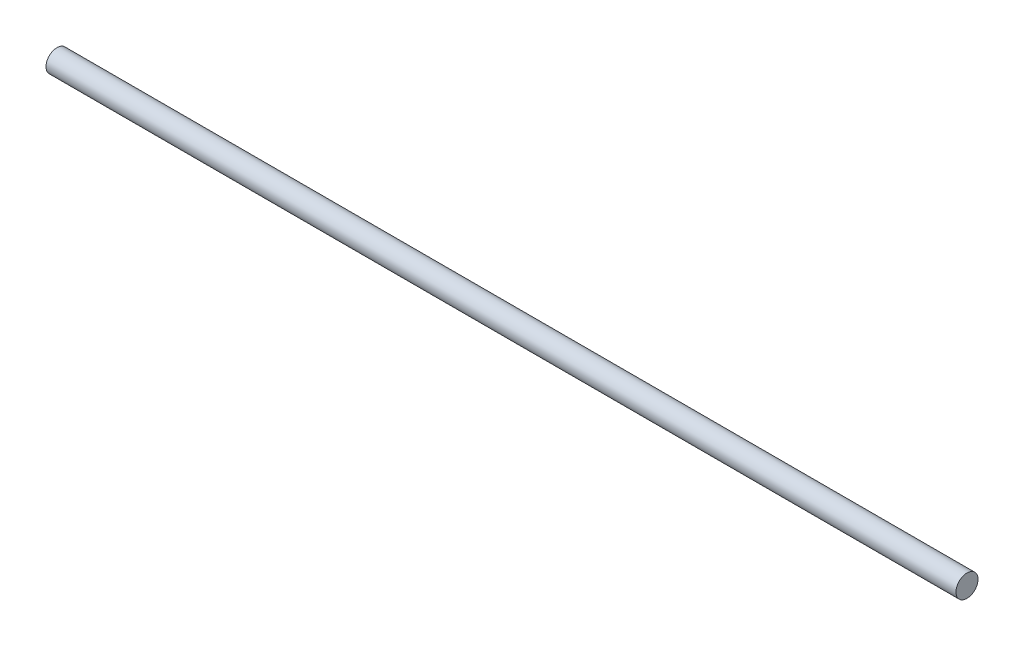
ISO-10303-21;
HEADER;
FILE_DESCRIPTION(('STEP AP214'),'2;1');
FILE_NAME('part.step','',(''),(''),'','','');
FILE_SCHEMA(('AUTOMOTIVE_DESIGN { 1 0 10303 214 1 1 1 1 }'));
ENDSEC;
DATA;
#1=APPLICATION_CONTEXT('core data for automotive mechanical design processes');
#2=APPLICATION_PROTOCOL_DEFINITION('international standard','automotive_design',2000,#1);
#3=PRODUCT_CONTEXT('',#1,'mechanical');
#4=PRODUCT('Part','Part','',(#3));
#5=PRODUCT_RELATED_PRODUCT_CATEGORY('part','',(#4));
#6=PRODUCT_DEFINITION_FORMATION('','',#4);
#7=PRODUCT_DEFINITION_CONTEXT('part definition',#1,'design');
#8=PRODUCT_DEFINITION('design','',#6,#7);
#9=PRODUCT_DEFINITION_SHAPE('','',#8);
#10=(LENGTH_UNIT() NAMED_UNIT(*) SI_UNIT(.MILLI.,.METRE.));
#11=(NAMED_UNIT(*) PLANE_ANGLE_UNIT() SI_UNIT($,.RADIAN.));
#12=(NAMED_UNIT(*) SI_UNIT($,.STERADIAN.) SOLID_ANGLE_UNIT());
#13=UNCERTAINTY_MEASURE_WITH_UNIT(LENGTH_MEASURE(1.E-05),#10,'distance_accuracy_value','');
#14=(GEOMETRIC_REPRESENTATION_CONTEXT(3) GLOBAL_UNCERTAINTY_ASSIGNED_CONTEXT((#13)) GLOBAL_UNIT_ASSIGNED_CONTEXT((#10,
#11,#12)) REPRESENTATION_CONTEXT('',''));
#15=CARTESIAN_POINT('',(0.,0.,0.));
#16=DIRECTION('',(0.,0.,1.));
#17=DIRECTION('',(1.,0.,0.));
#18=AXIS2_PLACEMENT_3D('',#15,#16,#17);
#19=CARTESIAN_POINT('',(364.805238636507,-14.0193474057974,18.4448964809771));
#20=DIRECTION('',(-1.,0.,0.));
#21=DIRECTION('',(0.,-1.,0.));
#22=AXIS2_PLACEMENT_3D('',#19,#20,#21);
#23=CYLINDRICAL_SURFACE('',#22,4.);
#24=CARTESIAN_POINT('',(364.805238636507,-14.0193474057974,18.4448964809771));
#25=DIRECTION('',(1.,0.,0.));
#26=DIRECTION('',(0.,1.,0.));
#27=AXIS2_PLACEMENT_3D('',#24,#25,#26);
#28=CIRCLE('',#27,4.);
#29=CARTESIAN_POINT('',(364.805238636507,-10.0193474057974,18.4448964809771));
#30=VERTEX_POINT('',#29);
#31=EDGE_CURVE('E12',#30,#30,#28,.T.);
#32=ORIENTED_EDGE('',*,*,#31,.F.);
#33=EDGE_LOOP('',(#32));
#34=FACE_BOUND('',#33,.T.);
#35=CARTESIAN_POINT('',(34.8052386365068,-14.019347405772,18.4448964809713));
#36=DIRECTION('',(1.,0.,0.));
#37=DIRECTION('',(0.,1.,0.));
#38=AXIS2_PLACEMENT_3D('',#35,#36,#37);
#39=CIRCLE('',#38,4.);
#40=CARTESIAN_POINT('',(34.8052386365071,-10.019347405772,18.4448964809713));
#41=VERTEX_POINT('',#40);
#42=EDGE_CURVE('E46',#41,#41,#39,.T.);
#43=ORIENTED_EDGE('',*,*,#42,.T.);
#44=EDGE_LOOP('',(#43));
#45=FACE_BOUND('',#44,.T.);
#46=ADVANCED_FACE('F43',(#34,#45),#23,.T.);
#47=CARTESIAN_POINT('',(364.805238636507,-14.0193474057974,18.4448964809771));
#48=DIRECTION('',(1.,0.,0.));
#49=DIRECTION('',(0.,1.,0.));
#50=AXIS2_PLACEMENT_3D('',#47,#48,#49);
#51=PLANE('',#50);
#52=ORIENTED_EDGE('',*,*,#31,.T.);
#53=EDGE_LOOP('',(#52));
#54=FACE_BOUND('',#53,.T.);
#55=ADVANCED_FACE('F58',(#54),#51,.T.);
#56=CARTESIAN_POINT('',(34.8052386365068,-14.019347405772,18.4448964809713));
#57=DIRECTION('',(1.,0.,0.));
#58=DIRECTION('',(0.,1.,0.));
#59=AXIS2_PLACEMENT_3D('',#56,#57,#58);
#60=PLANE('',#59);
#61=ORIENTED_EDGE('',*,*,#42,.F.);
#62=EDGE_LOOP('',(#61));
#63=FACE_BOUND('',#62,.T.);
#64=ADVANCED_FACE('F56',(#63),#60,.F.);
#65=CLOSED_SHELL('',(#46,#55,#64));
#66=MANIFOLD_SOLID_BREP('B2',#65);
#67=ADVANCED_BREP_SHAPE_REPRESENTATION('',(#18,#66),#14);
#68=SHAPE_DEFINITION_REPRESENTATION(#9,#67);
ENDSEC;
END-ISO-10303-21;
